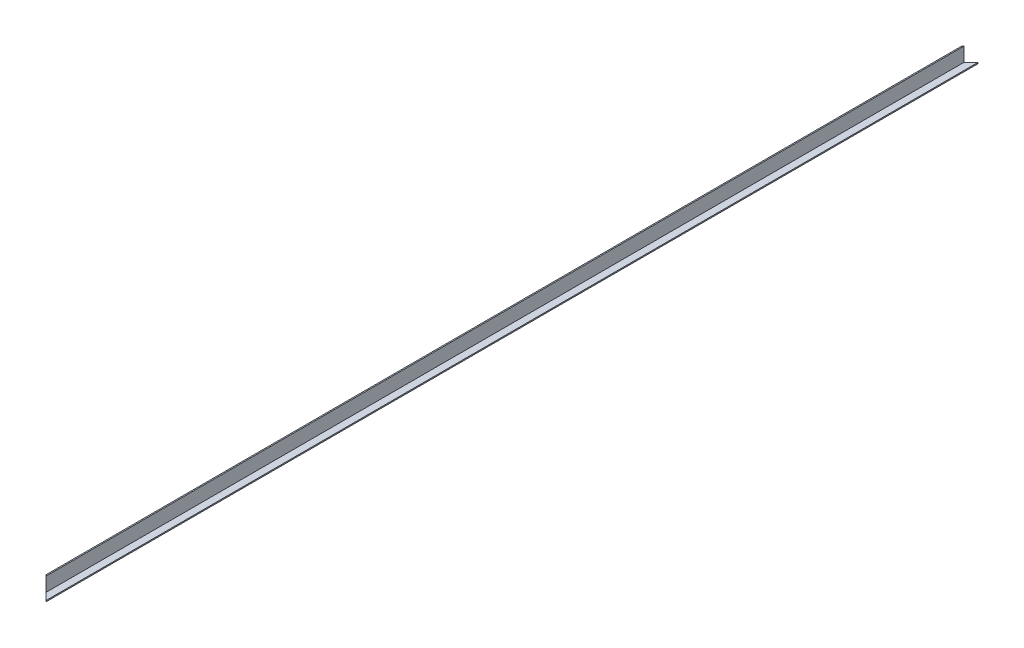
ISO-10303-21;
HEADER;
FILE_DESCRIPTION(('STEP AP214'),'2;1');
FILE_NAME('part.step','',(''),(''),'','','');
FILE_SCHEMA(('AUTOMOTIVE_DESIGN { 1 0 10303 214 1 1 1 1 }'));
ENDSEC;
DATA;
#1=APPLICATION_CONTEXT('core data for automotive mechanical design processes');
#2=APPLICATION_PROTOCOL_DEFINITION('international standard','automotive_design',2000,#1);
#3=PRODUCT_CONTEXT('',#1,'mechanical');
#4=PRODUCT('Part','Part','',(#3));
#5=PRODUCT_RELATED_PRODUCT_CATEGORY('part','',(#4));
#6=PRODUCT_DEFINITION_FORMATION('','',#4);
#7=PRODUCT_DEFINITION_CONTEXT('part definition',#1,'design');
#8=PRODUCT_DEFINITION('design','',#6,#7);
#9=PRODUCT_DEFINITION_SHAPE('','',#8);
#10=(LENGTH_UNIT() NAMED_UNIT(*) SI_UNIT(.MILLI.,.METRE.));
#11=(NAMED_UNIT(*) PLANE_ANGLE_UNIT() SI_UNIT($,.RADIAN.));
#12=(NAMED_UNIT(*) SI_UNIT($,.STERADIAN.) SOLID_ANGLE_UNIT());
#13=UNCERTAINTY_MEASURE_WITH_UNIT(LENGTH_MEASURE(1.E-05),#10,'distance_accuracy_value','');
#14=(GEOMETRIC_REPRESENTATION_CONTEXT(3) GLOBAL_UNCERTAINTY_ASSIGNED_CONTEXT((#13)) GLOBAL_UNIT_ASSIGNED_CONTEXT((#10,
#11,#12)) REPRESENTATION_CONTEXT('',''));
#15=CARTESIAN_POINT('',(0.,0.,0.));
#16=DIRECTION('',(0.,0.,1.));
#17=DIRECTION('',(1.,0.,0.));
#18=AXIS2_PLACEMENT_3D('',#15,#16,#17);
#19=CARTESIAN_POINT('',(9.75,-8.25,1190.));
#20=DIRECTION('',(-1.,0.,0.));
#21=DIRECTION('',(0.,0.,1.));
#22=AXIS2_PLACEMENT_3D('',#19,#20,#21);
#23=PLANE('',#22);
#24=DIRECTION('',(0.,1.,0.));
#25=VECTOR('',#24,1.);
#26=CARTESIAN_POINT('',(9.75,-8.25,0.));
#27=LINE('',#26,#25);
#28=CARTESIAN_POINT('',(9.75,-9.75,0.));
#29=VERTEX_POINT('',#28);
#30=CARTESIAN_POINT('',(9.75,-8.25,0.));
#31=VERTEX_POINT('',#30);
#32=EDGE_CURVE('E149',#29,#31,#27,.T.);
#33=ORIENTED_EDGE('',*,*,#32,.T.);
#34=DIRECTION('',(0.,0.,-1.));
#35=VECTOR('',#34,1.);
#36=CARTESIAN_POINT('',(9.75,-8.25,1190.));
#37=LINE('',#36,#35);
#38=CARTESIAN_POINT('',(9.75,-8.25,1190.));
#39=VERTEX_POINT('',#38);
#40=EDGE_CURVE('E11',#39,#31,#37,.T.);
#41=ORIENTED_EDGE('',*,*,#40,.F.);
#42=DIRECTION('',(0.,1.,0.));
#43=VECTOR('',#42,1.);
#44=CARTESIAN_POINT('',(9.75,-8.25,1190.));
#45=LINE('',#44,#43);
#46=CARTESIAN_POINT('',(9.75,-9.75,1190.));
#47=VERTEX_POINT('',#46);
#48=EDGE_CURVE('E117',#47,#39,#45,.T.);
#49=ORIENTED_EDGE('',*,*,#48,.F.);
#50=DIRECTION('',(0.,0.,-1.));
#51=VECTOR('',#50,1.);
#52=CARTESIAN_POINT('',(9.75,-9.75,1190.));
#53=LINE('',#52,#51);
#54=EDGE_CURVE('E105',#47,#29,#53,.T.);
#55=ORIENTED_EDGE('',*,*,#54,.T.);
#56=EDGE_LOOP('',(#33,#41,#49,#55));
#57=FACE_BOUND('',#56,.T.);
#58=ADVANCED_FACE('F33',(#57),#23,.F.);
#59=CARTESIAN_POINT('',(0.75,-8.25,1190.));
#60=DIRECTION('',(0.,-1.,0.));
#61=DIRECTION('',(0.,0.,-1.));
#62=AXIS2_PLACEMENT_3D('',#59,#60,#61);
#63=PLANE('',#62);
#64=DIRECTION('',(0.,0.,-1.));
#65=VECTOR('',#64,1.);
#66=CARTESIAN_POINT('',(0.75,-8.25,1190.));
#67=LINE('',#66,#65);
#68=CARTESIAN_POINT('',(0.75,-8.25,1181.));
#69=VERTEX_POINT('',#68);
#70=CARTESIAN_POINT('',(0.75,-8.25,9.00000000000012));
#71=VERTEX_POINT('',#70);
#72=EDGE_CURVE('E41',#69,#71,#67,.T.);
#73=ORIENTED_EDGE('',*,*,#72,.F.);
#74=DIRECTION('',(0.70710678118655,0.,0.707106781186545));
#75=VECTOR('',#74,1.);
#76=CARTESIAN_POINT('',(5.24999999999997,-8.25,1185.5));
#77=LINE('',#76,#75);
#78=EDGE_CURVE('E153',#69,#39,#77,.T.);
#79=ORIENTED_EDGE('',*,*,#78,.T.);
#80=ORIENTED_EDGE('',*,*,#40,.T.);
#81=DIRECTION('',(-0.707106781186538,0.,0.707106781186557));
#82=VECTOR('',#81,1.);
#83=CARTESIAN_POINT('',(-589.75,-8.25,599.500000000016));
#84=LINE('',#83,#82);
#85=EDGE_CURVE('E140',#31,#71,#84,.T.);
#86=ORIENTED_EDGE('',*,*,#85,.T.);
#87=EDGE_LOOP('',(#73,#79,#80,#86));
#88=FACE_BOUND('',#87,.T.);
#89=ADVANCED_FACE('F146',(#88),#63,.F.);
#90=CARTESIAN_POINT('',(0.75,9.75,1190.));
#91=DIRECTION('',(-1.,0.,0.));
#92=DIRECTION('',(0.,0.,1.));
#93=AXIS2_PLACEMENT_3D('',#90,#91,#92);
#94=PLANE('',#93);
#95=DIRECTION('',(0.,0.,-1.));
#96=VECTOR('',#95,1.);
#97=CARTESIAN_POINT('',(0.75,9.75,1190.));
#98=LINE('',#97,#96);
#99=CARTESIAN_POINT('',(0.750000000000018,9.75,1181.));
#100=VERTEX_POINT('',#99);
#101=CARTESIAN_POINT('',(0.750000000000028,9.75,9.00000000000023));
#102=VERTEX_POINT('',#101);
#103=EDGE_CURVE('E124',#100,#102,#98,.T.);
#104=ORIENTED_EDGE('',*,*,#103,.F.);
#105=DIRECTION('',(0.,-1.,0.));
#106=VECTOR('',#105,1.);
#107=CARTESIAN_POINT('',(0.75,9.75,1181.));
#108=LINE('',#107,#106);
#109=EDGE_CURVE('E133',#100,#69,#108,.T.);
#110=ORIENTED_EDGE('',*,*,#109,.T.);
#111=ORIENTED_EDGE('',*,*,#72,.T.);
#112=DIRECTION('',(0.,1.,0.));
#113=VECTOR('',#112,1.);
#114=CARTESIAN_POINT('',(0.75,9.75,9.00000000000012));
#115=LINE('',#114,#113);
#116=EDGE_CURVE('E132',#71,#102,#115,.T.);
#117=ORIENTED_EDGE('',*,*,#116,.T.);
#118=EDGE_LOOP('',(#104,#110,#111,#117));
#119=FACE_BOUND('',#118,.T.);
#120=ADVANCED_FACE('F131',(#119),#94,.F.);
#121=CARTESIAN_POINT('',(-0.75,9.75,1190.));
#122=DIRECTION('',(0.,-1.,0.));
#123=DIRECTION('',(0.,0.,-1.));
#124=AXIS2_PLACEMENT_3D('',#121,#122,#123);
#125=PLANE('',#124);
#126=DIRECTION('',(0.,0.,-1.));
#127=VECTOR('',#126,1.);
#128=CARTESIAN_POINT('',(-0.75,9.75,1190.));
#129=LINE('',#128,#127);
#130=CARTESIAN_POINT('',(-0.749999999999999,9.75,1179.5));
#131=VERTEX_POINT('',#130);
#132=CARTESIAN_POINT('',(-0.750000000000025,9.75,10.5000000000004));
#133=VERTEX_POINT('',#132);
#134=EDGE_CURVE('E122',#131,#133,#129,.T.);
#135=ORIENTED_EDGE('',*,*,#134,.F.);
#136=DIRECTION('',(-0.70710678118655,0.,-0.707106781186545));
#137=VECTOR('',#136,1.);
#138=CARTESIAN_POINT('',(9.75,9.75,1190.));
#139=LINE('',#138,#137);
#140=EDGE_CURVE('E107',#100,#131,#139,.T.);
#141=ORIENTED_EDGE('',*,*,#140,.F.);
#142=ORIENTED_EDGE('',*,*,#103,.T.);
#143=DIRECTION('',(0.707106781186538,0.,-0.707106781186557));
#144=VECTOR('',#143,1.);
#145=CARTESIAN_POINT('',(9.75,9.75,0.));
#146=LINE('',#145,#144);
#147=EDGE_CURVE('E143',#133,#102,#146,.T.);
#148=ORIENTED_EDGE('',*,*,#147,.F.);
#149=EDGE_LOOP('',(#135,#141,#142,#148));
#150=FACE_BOUND('',#149,.T.);
#151=ADVANCED_FACE('F171',(#150),#125,.F.);
#152=CARTESIAN_POINT('',(-0.75,9.75,1190.));
#153=DIRECTION('',(1.,0.,0.));
#154=DIRECTION('',(0.,1.,0.));
#155=AXIS2_PLACEMENT_3D('',#152,#153,#154);
#156=PLANE('',#155);
#157=DIRECTION('',(0.,0.,-1.));
#158=VECTOR('',#157,1.);
#159=CARTESIAN_POINT('',(-0.75,-8.25,1190.));
#160=LINE('',#159,#158);
#161=CARTESIAN_POINT('',(-0.75,-8.25,1179.5));
#162=VERTEX_POINT('',#161);
#163=CARTESIAN_POINT('',(-0.750000000000028,-8.25,10.5));
#164=VERTEX_POINT('',#163);
#165=EDGE_CURVE('E115',#162,#164,#160,.T.);
#166=ORIENTED_EDGE('',*,*,#165,.F.);
#167=DIRECTION('',(0.,1.,0.));
#168=VECTOR('',#167,1.);
#169=CARTESIAN_POINT('',(-0.75,9.75,1179.5));
#170=LINE('',#169,#168);
#171=EDGE_CURVE('E176',#162,#131,#170,.T.);
#172=ORIENTED_EDGE('',*,*,#171,.T.);
#173=ORIENTED_EDGE('',*,*,#134,.T.);
#174=DIRECTION('',(0.,-1.,0.));
#175=VECTOR('',#174,1.);
#176=CARTESIAN_POINT('',(-0.75,9.74999999999998,10.5000000000004));
#177=LINE('',#176,#175);
#178=EDGE_CURVE('E144',#133,#164,#177,.T.);
#179=ORIENTED_EDGE('',*,*,#178,.T.);
#180=EDGE_LOOP('',(#166,#172,#173,#179));
#181=FACE_BOUND('',#180,.T.);
#182=ADVANCED_FACE('F166',(#181),#156,.F.);
#183=CARTESIAN_POINT('',(-9.75,-8.25,1190.));
#184=DIRECTION('',(0.,-1.,0.));
#185=DIRECTION('',(0.,0.,-1.));
#186=AXIS2_PLACEMENT_3D('',#183,#184,#185);
#187=PLANE('',#186);
#188=DIRECTION('',(0.,0.,-1.));
#189=VECTOR('',#188,1.);
#190=CARTESIAN_POINT('',(-9.75,-8.25,1190.));
#191=LINE('',#190,#189);
#192=CARTESIAN_POINT('',(-9.75,-8.25,1170.5));
#193=VERTEX_POINT('',#192);
#194=CARTESIAN_POINT('',(-9.75,-8.25,19.5000000000005));
#195=VERTEX_POINT('',#194);
#196=EDGE_CURVE('E113',#193,#195,#191,.T.);
#197=ORIENTED_EDGE('',*,*,#196,.F.);
#198=DIRECTION('',(0.70710678118655,0.,0.707106781186545));
#199=VECTOR('',#198,1.);
#200=CARTESIAN_POINT('',(0.,-8.25,1180.25));
#201=LINE('',#200,#199);
#202=EDGE_CURVE('E94',#193,#162,#201,.T.);
#203=ORIENTED_EDGE('',*,*,#202,.T.);
#204=ORIENTED_EDGE('',*,*,#165,.T.);
#205=DIRECTION('',(-0.707106781186538,0.,0.707106781186557));
#206=VECTOR('',#205,1.);
#207=CARTESIAN_POINT('',(-595.,-8.25,604.750000000016));
#208=LINE('',#207,#206);
#209=EDGE_CURVE('E158',#164,#195,#208,.T.);
#210=ORIENTED_EDGE('',*,*,#209,.T.);
#211=EDGE_LOOP('',(#197,#203,#204,#210));
#212=FACE_BOUND('',#211,.T.);
#213=ADVANCED_FACE('F179',(#212),#187,.F.);
#214=CARTESIAN_POINT('',(-9.75,-8.25,1190.));
#215=DIRECTION('',(1.,0.,0.));
#216=DIRECTION('',(0.,0.,-1.));
#217=AXIS2_PLACEMENT_3D('',#214,#215,#216);
#218=PLANE('',#217);
#219=DIRECTION('',(0.,0.,-1.));
#220=VECTOR('',#219,1.);
#221=CARTESIAN_POINT('',(-9.75,-9.75,1190.));
#222=LINE('',#221,#220);
#223=CARTESIAN_POINT('',(-9.75,-9.75,1170.5));
#224=VERTEX_POINT('',#223);
#225=CARTESIAN_POINT('',(-9.75,-9.75,19.5000000000005));
#226=VERTEX_POINT('',#225);
#227=EDGE_CURVE('E102',#224,#226,#222,.T.);
#228=ORIENTED_EDGE('',*,*,#227,.F.);
#229=DIRECTION('',(0.,1.,0.));
#230=VECTOR('',#229,1.);
#231=CARTESIAN_POINT('',(-9.75,-9.75,1170.5));
#232=LINE('',#231,#230);
#233=EDGE_CURVE('E91',#224,#193,#232,.T.);
#234=ORIENTED_EDGE('',*,*,#233,.T.);
#235=ORIENTED_EDGE('',*,*,#196,.T.);
#236=DIRECTION('',(0.,1.,0.));
#237=VECTOR('',#236,1.);
#238=CARTESIAN_POINT('',(-9.75,-9.75,19.5000000000005));
#239=LINE('',#238,#237);
#240=EDGE_CURVE('E112',#226,#195,#239,.T.);
#241=ORIENTED_EDGE('',*,*,#240,.F.);
#242=EDGE_LOOP('',(#228,#234,#235,#241));
#243=FACE_BOUND('',#242,.T.);
#244=ADVANCED_FACE('F110',(#243),#218,.F.);
#245=CARTESIAN_POINT('',(-9.75,-9.75,1190.));
#246=DIRECTION('',(0.,1.,0.));
#247=DIRECTION('',(0.,0.,1.));
#248=AXIS2_PLACEMENT_3D('',#245,#246,#247);
#249=PLANE('',#248);
#250=ORIENTED_EDGE('',*,*,#54,.F.);
#251=DIRECTION('',(-0.70710678118655,0.,-0.707106781186545));
#252=VECTOR('',#251,1.);
#253=CARTESIAN_POINT('',(9.75,-9.75,1190.));
#254=LINE('',#253,#252);
#255=EDGE_CURVE('E47',#47,#224,#254,.T.);
#256=ORIENTED_EDGE('',*,*,#255,.T.);
#257=ORIENTED_EDGE('',*,*,#227,.T.);
#258=DIRECTION('',(0.707106781186538,0.,-0.707106781186557));
#259=VECTOR('',#258,1.);
#260=CARTESIAN_POINT('',(9.75,-9.75,0.));
#261=LINE('',#260,#259);
#262=EDGE_CURVE('E156',#226,#29,#261,.T.);
#263=ORIENTED_EDGE('',*,*,#262,.T.);
#264=EDGE_LOOP('',(#250,#256,#257,#263));
#265=FACE_BOUND('',#264,.T.);
#266=ADVANCED_FACE('F100',(#265),#249,.F.);
#267=CARTESIAN_POINT('',(9.75,-9.75,0.));
#268=DIRECTION('',(0.707106781186557,0.,0.707106781186538));
#269=DIRECTION('',(0.707106781186538,0.,-0.707106781186557));
#270=AXIS2_PLACEMENT_3D('',#267,#268,#269);
#271=PLANE('',#270);
#272=ORIENTED_EDGE('',*,*,#32,.F.);
#273=ORIENTED_EDGE('',*,*,#262,.F.);
#274=ORIENTED_EDGE('',*,*,#240,.T.);
#275=ORIENTED_EDGE('',*,*,#209,.F.);
#276=ORIENTED_EDGE('',*,*,#178,.F.);
#277=ORIENTED_EDGE('',*,*,#147,.T.);
#278=ORIENTED_EDGE('',*,*,#116,.F.);
#279=ORIENTED_EDGE('',*,*,#85,.F.);
#280=EDGE_LOOP('',(#272,#273,#274,#275,#276,#277,#278,#279));
#281=FACE_BOUND('',#280,.T.);
#282=ADVANCED_FACE('F139',(#281),#271,.F.);
#283=CARTESIAN_POINT('',(9.75,-9.75,1190.));
#284=DIRECTION('',(0.707106781186545,0.,-0.70710678118655));
#285=DIRECTION('',(-0.70710678118655,0.,-0.707106781186545));
#286=AXIS2_PLACEMENT_3D('',#283,#284,#285);
#287=PLANE('',#286);
#288=ORIENTED_EDGE('',*,*,#109,.F.);
#289=ORIENTED_EDGE('',*,*,#140,.T.);
#290=ORIENTED_EDGE('',*,*,#171,.F.);
#291=ORIENTED_EDGE('',*,*,#202,.F.);
#292=ORIENTED_EDGE('',*,*,#233,.F.);
#293=ORIENTED_EDGE('',*,*,#255,.F.);
#294=ORIENTED_EDGE('',*,*,#48,.T.);
#295=ORIENTED_EDGE('',*,*,#78,.F.);
#296=EDGE_LOOP('',(#288,#289,#290,#291,#292,#293,#294,#295));
#297=FACE_BOUND('',#296,.T.);
#298=ADVANCED_FACE('F92',(#297),#287,.F.);
#299=CLOSED_SHELL('',(#58,#89,#120,#151,#182,#213,#244,#266,#282,#298));
#300=MANIFOLD_SOLID_BREP('B2',#299);
#301=ADVANCED_BREP_SHAPE_REPRESENTATION('',(#18,#300),#14);
#302=SHAPE_DEFINITION_REPRESENTATION(#9,#301);
ENDSEC;
END-ISO-10303-21;
